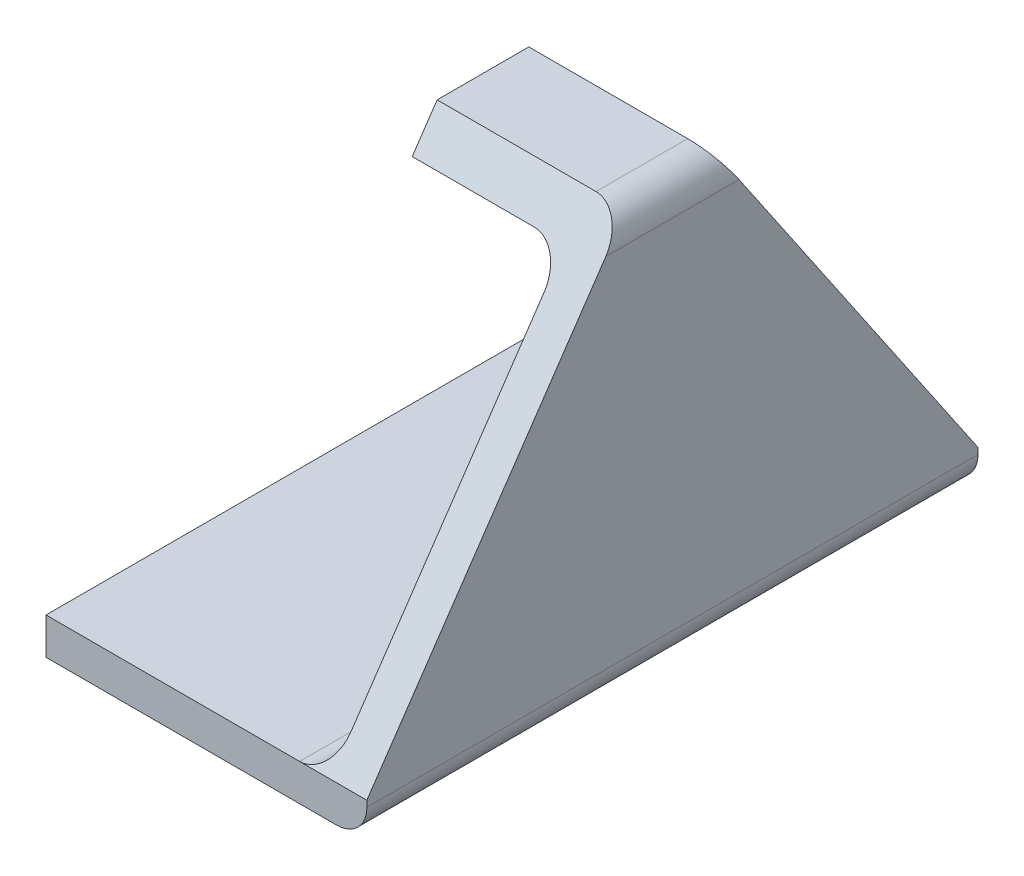
ISO-10303-21;
HEADER;
FILE_DESCRIPTION(('STEP AP214'),'2;1');
FILE_NAME('part.step','',(''),(''),'','','');
FILE_SCHEMA(('AUTOMOTIVE_DESIGN { 1 0 10303 214 1 1 1 1 }'));
ENDSEC;
DATA;
#1=APPLICATION_CONTEXT('core data for automotive mechanical design processes');
#2=APPLICATION_PROTOCOL_DEFINITION('international standard','automotive_design',2000,#1);
#3=PRODUCT_CONTEXT('',#1,'mechanical');
#4=PRODUCT('Part','Part','',(#3));
#5=PRODUCT_RELATED_PRODUCT_CATEGORY('part','',(#4));
#6=PRODUCT_DEFINITION_FORMATION('','',#4);
#7=PRODUCT_DEFINITION_CONTEXT('part definition',#1,'design');
#8=PRODUCT_DEFINITION('design','',#6,#7);
#9=PRODUCT_DEFINITION_SHAPE('','',#8);
#10=(LENGTH_UNIT() NAMED_UNIT(*) SI_UNIT(.MILLI.,.METRE.));
#11=(NAMED_UNIT(*) PLANE_ANGLE_UNIT() SI_UNIT($,.RADIAN.));
#12=(NAMED_UNIT(*) SI_UNIT($,.STERADIAN.) SOLID_ANGLE_UNIT());
#13=UNCERTAINTY_MEASURE_WITH_UNIT(LENGTH_MEASURE(1.E-05),#10,'distance_accuracy_value','');
#14=(GEOMETRIC_REPRESENTATION_CONTEXT(3) GLOBAL_UNCERTAINTY_ASSIGNED_CONTEXT((#13)) GLOBAL_UNIT_ASSIGNED_CONTEXT((#10,
#11,#12)) REPRESENTATION_CONTEXT('',''));
#15=CARTESIAN_POINT('',(0.,0.,0.));
#16=DIRECTION('',(0.,0.,1.));
#17=DIRECTION('',(1.,0.,0.));
#18=AXIS2_PLACEMENT_3D('',#15,#16,#17);
#19=CARTESIAN_POINT('',(0.93,1.37,0.));
#20=DIRECTION('',(1.,0.,0.));
#21=DIRECTION('',(0.,0.,-1.));
#22=AXIS2_PLACEMENT_3D('',#19,#20,#21);
#23=PLANE('',#22);
#24=DIRECTION('',(0.,-0.826926502069528,-0.562310021407279));
#25=VECTOR('',#24,1.);
#26=CARTESIAN_POINT('',(0.93,1.90473741794311,-0.786378555798687));
#27=LINE('',#26,#25);
#28=CARTESIAN_POINT('',(0.93,1.15,-1.2996));
#29=VERTEX_POINT('',#28);
#30=CARTESIAN_POINT('',(0.93,0.22,-1.932));
#31=VERTEX_POINT('',#30);
#32=EDGE_CURVE('E11',#29,#31,#27,.T.);
#33=ORIENTED_EDGE('',*,*,#32,.T.);
#34=DIRECTION('',(0.,0.,1.));
#35=VECTOR('',#34,1.);
#36=CARTESIAN_POINT('',(0.93,0.22,0.));
#37=LINE('',#36,#35);
#38=CARTESIAN_POINT('',(0.93,0.22,-0.0680000000000001));
#39=VERTEX_POINT('',#38);
#40=EDGE_CURVE('E24',#31,#39,#37,.T.);
#41=ORIENTED_EDGE('',*,*,#40,.T.);
#42=DIRECTION('',(0.,0.826926502069528,-0.562310021407279));
#43=VECTOR('',#42,1.);
#44=CARTESIAN_POINT('',(0.93,0.974759299781182,-0.581236323851204));
#45=LINE('',#44,#43);
#46=CARTESIAN_POINT('',(0.93,1.15,-0.7004));
#47=VERTEX_POINT('',#46);
#48=EDGE_CURVE('E242',#39,#47,#45,.T.);
#49=ORIENTED_EDGE('',*,*,#48,.T.);
#50=DIRECTION('',(0.,0.,-1.));
#51=VECTOR('',#50,1.);
#52=CARTESIAN_POINT('',(0.93,1.15,-1.2316));
#53=LINE('',#52,#51);
#54=EDGE_CURVE('E240',#47,#29,#53,.T.);
#55=ORIENTED_EDGE('',*,*,#54,.T.);
#56=EDGE_LOOP('',(#33,#41,#49,#55));
#57=FACE_BOUND('',#56,.T.);
#58=ADVANCED_FACE('F17',(#57),#23,.F.);
#59=CARTESIAN_POINT('',(0.,0.12,-2.));
#60=DIRECTION('',(0.,-1.,0.));
#61=DIRECTION('',(0.,0.,-1.));
#62=AXIS2_PLACEMENT_3D('',#59,#60,#61);
#63=PLANE('',#62);
#64=DIRECTION('',(1.,0.,0.));
#65=VECTOR('',#64,1.);
#66=CARTESIAN_POINT('',(0.,0.12,0.));
#67=LINE('',#66,#65);
#68=CARTESIAN_POINT('',(0.,0.12,0.));
#69=VERTEX_POINT('',#68);
#70=CARTESIAN_POINT('',(0.83,0.12,0.));
#71=VERTEX_POINT('',#70);
#72=EDGE_CURVE('E238',#69,#71,#67,.T.);
#73=ORIENTED_EDGE('',*,*,#72,.T.);
#74=DIRECTION('',(0.,0.,-1.));
#75=VECTOR('',#74,1.);
#76=CARTESIAN_POINT('',(0.83,0.12,-2.));
#77=LINE('',#76,#75);
#78=CARTESIAN_POINT('',(0.83,0.12,-2.));
#79=VERTEX_POINT('',#78);
#80=EDGE_CURVE('E236',#71,#79,#77,.T.);
#81=ORIENTED_EDGE('',*,*,#80,.T.);
#82=DIRECTION('',(-1.,0.,0.));
#83=VECTOR('',#82,1.);
#84=CARTESIAN_POINT('',(0.,0.12,-2.));
#85=LINE('',#84,#83);
#86=CARTESIAN_POINT('',(0.,0.12,-2.));
#87=VERTEX_POINT('',#86);
#88=EDGE_CURVE('E234',#79,#87,#85,.T.);
#89=ORIENTED_EDGE('',*,*,#88,.T.);
#90=DIRECTION('',(0.,0.,1.));
#91=VECTOR('',#90,1.);
#92=CARTESIAN_POINT('',(0.,0.12,0.));
#93=LINE('',#92,#91);
#94=EDGE_CURVE('E231',#87,#69,#93,.T.);
#95=ORIENTED_EDGE('',*,*,#94,.T.);
#96=EDGE_LOOP('',(#73,#81,#89,#95));
#97=FACE_BOUND('',#96,.T.);
#98=ADVANCED_FACE('F284',(#97),#63,.F.);
#99=CARTESIAN_POINT('',(0.,0.12,0.));
#100=DIRECTION('',(1.,0.,0.));
#101=DIRECTION('',(0.,0.,-1.));
#102=AXIS2_PLACEMENT_3D('',#99,#100,#101);
#103=PLANE('',#102);
#104=DIRECTION('',(0.,0.,1.));
#105=VECTOR('',#104,1.);
#106=CARTESIAN_POINT('',(0.,0.,0.));
#107=LINE('',#106,#105);
#108=CARTESIAN_POINT('',(0.,0.,-2.));
#109=VERTEX_POINT('',#108);
#110=CARTESIAN_POINT('',(0.,0.,0.));
#111=VERTEX_POINT('',#110);
#112=EDGE_CURVE('E229',#109,#111,#107,.T.);
#113=ORIENTED_EDGE('',*,*,#112,.T.);
#114=DIRECTION('',(0.,-1.,0.));
#115=VECTOR('',#114,1.);
#116=CARTESIAN_POINT('',(0.,0.12,0.));
#117=LINE('',#116,#115);
#118=EDGE_CURVE('E226',#69,#111,#117,.T.);
#119=ORIENTED_EDGE('',*,*,#118,.F.);
#120=ORIENTED_EDGE('',*,*,#94,.F.);
#121=DIRECTION('',(0.,-1.,0.));
#122=VECTOR('',#121,1.);
#123=CARTESIAN_POINT('',(0.,0.12,-2.));
#124=LINE('',#123,#122);
#125=EDGE_CURVE('E223',#87,#109,#124,.T.);
#126=ORIENTED_EDGE('',*,*,#125,.T.);
#127=EDGE_LOOP('',(#113,#119,#120,#126));
#128=FACE_BOUND('',#127,.T.);
#129=ADVANCED_FACE('F288',(#128),#103,.F.);
#130=CARTESIAN_POINT('',(0.,0.12,0.));
#131=DIRECTION('',(0.,0.,-1.));
#132=DIRECTION('',(-1.,0.,0.));
#133=AXIS2_PLACEMENT_3D('',#130,#131,#132);
#134=PLANE('',#133);
#135=DIRECTION('',(1.,0.,0.));
#136=VECTOR('',#135,1.);
#137=CARTESIAN_POINT('',(0.,0.,0.));
#138=LINE('',#137,#136);
#139=CARTESIAN_POINT('',(0.95,0.,0.));
#140=VERTEX_POINT('',#139);
#141=EDGE_CURVE('E221',#111,#140,#138,.T.);
#142=ORIENTED_EDGE('',*,*,#141,.T.);
#143=CARTESIAN_POINT('',(0.95,0.1,0.));
#144=DIRECTION('',(0.,0.,1.));
#145=DIRECTION('',(-1.,0.,0.));
#146=AXIS2_PLACEMENT_3D('',#143,#144,#145);
#147=CIRCLE('',#146,0.1);
#148=CARTESIAN_POINT('',(1.05,0.1,0.));
#149=VERTEX_POINT('',#148);
#150=EDGE_CURVE('E219',#140,#149,#147,.T.);
#151=ORIENTED_EDGE('',*,*,#150,.T.);
#152=DIRECTION('',(0.,-1.,0.));
#153=VECTOR('',#152,1.);
#154=CARTESIAN_POINT('',(1.05,0.12,0.));
#155=LINE('',#154,#153);
#156=CARTESIAN_POINT('',(1.05,0.12,0.));
#157=VERTEX_POINT('',#156);
#158=EDGE_CURVE('E216',#157,#149,#155,.T.);
#159=ORIENTED_EDGE('',*,*,#158,.F.);
#160=DIRECTION('',(1.,0.,0.));
#161=VECTOR('',#160,1.);
#162=CARTESIAN_POINT('',(-0.2,0.12,0.));
#163=LINE('',#162,#161);
#164=EDGE_CURVE('E213',#71,#157,#163,.T.);
#165=ORIENTED_EDGE('',*,*,#164,.F.);
#166=ORIENTED_EDGE('',*,*,#72,.F.);
#167=ORIENTED_EDGE('',*,*,#118,.T.);
#168=EDGE_LOOP('',(#142,#151,#159,#165,#166,#167));
#169=FACE_BOUND('',#168,.T.);
#170=ADVANCED_FACE('F257',(#169),#134,.F.);
#171=CARTESIAN_POINT('',(1.05,0.12,0.));
#172=DIRECTION('',(-1.,0.,0.));
#173=DIRECTION('',(0.,0.,1.));
#174=AXIS2_PLACEMENT_3D('',#171,#172,#173);
#175=PLANE('',#174);
#176=ORIENTED_EDGE('',*,*,#158,.T.);
#177=DIRECTION('',(0.,0.,-1.));
#178=VECTOR('',#177,1.);
#179=CARTESIAN_POINT('',(1.05,0.1,-2.));
#180=LINE('',#179,#178);
#181=CARTESIAN_POINT('',(1.05,0.1,-2.));
#182=VERTEX_POINT('',#181);
#183=EDGE_CURVE('E211',#149,#182,#180,.T.);
#184=ORIENTED_EDGE('',*,*,#183,.T.);
#185=DIRECTION('',(0.,-1.,0.));
#186=VECTOR('',#185,1.);
#187=CARTESIAN_POINT('',(1.05,0.12,-2.));
#188=LINE('',#187,#186);
#189=CARTESIAN_POINT('',(1.05,0.12,-2.));
#190=VERTEX_POINT('',#189);
#191=EDGE_CURVE('E208',#190,#182,#188,.T.);
#192=ORIENTED_EDGE('',*,*,#191,.F.);
#193=DIRECTION('',(0.,-0.826926502069528,-0.562310021407279));
#194=VECTOR('',#193,1.);
#195=CARTESIAN_POINT('',(1.05,0.12,-2.));
#196=LINE('',#195,#194);
#197=CARTESIAN_POINT('',(1.05,1.27,-1.218));
#198=VERTEX_POINT('',#197);
#199=EDGE_CURVE('E205',#198,#190,#196,.T.);
#200=ORIENTED_EDGE('',*,*,#199,.F.);
#201=DIRECTION('',(0.,0.,1.));
#202=VECTOR('',#201,1.);
#203=CARTESIAN_POINT('',(1.05,1.27,-0.85));
#204=LINE('',#203,#202);
#205=CARTESIAN_POINT('',(1.05,1.27,-0.782));
#206=VERTEX_POINT('',#205);
#207=EDGE_CURVE('E203',#198,#206,#204,.T.);
#208=ORIENTED_EDGE('',*,*,#207,.T.);
#209=DIRECTION('',(0.,0.826926502069528,-0.562310021407279));
#210=VECTOR('',#209,1.);
#211=CARTESIAN_POINT('',(1.05,1.37,-0.85));
#212=LINE('',#211,#210);
#213=EDGE_CURVE('E200',#157,#206,#212,.T.);
#214=ORIENTED_EDGE('',*,*,#213,.F.);
#215=EDGE_LOOP('',(#176,#184,#192,#200,#208,#214));
#216=FACE_BOUND('',#215,.T.);
#217=ADVANCED_FACE('F261',(#216),#175,.F.);
#218=CARTESIAN_POINT('',(0.,0.12,-2.));
#219=DIRECTION('',(0.,0.,1.));
#220=DIRECTION('',(1.,0.,0.));
#221=AXIS2_PLACEMENT_3D('',#218,#219,#220);
#222=PLANE('',#221);
#223=ORIENTED_EDGE('',*,*,#191,.T.);
#224=CARTESIAN_POINT('',(0.95,0.1,-2.));
#225=DIRECTION('',(0.,0.,-1.));
#226=DIRECTION('',(1.,0.,0.));
#227=AXIS2_PLACEMENT_3D('',#224,#225,#226);
#228=CIRCLE('',#227,0.1);
#229=CARTESIAN_POINT('',(0.95,0.,-2.));
#230=VERTEX_POINT('',#229);
#231=EDGE_CURVE('E198',#182,#230,#228,.T.);
#232=ORIENTED_EDGE('',*,*,#231,.T.);
#233=DIRECTION('',(-1.,0.,0.));
#234=VECTOR('',#233,1.);
#235=CARTESIAN_POINT('',(0.,0.,-2.));
#236=LINE('',#235,#234);
#237=EDGE_CURVE('E195',#230,#109,#236,.T.);
#238=ORIENTED_EDGE('',*,*,#237,.T.);
#239=ORIENTED_EDGE('',*,*,#125,.F.);
#240=ORIENTED_EDGE('',*,*,#88,.F.);
#241=DIRECTION('',(1.,0.,0.));
#242=VECTOR('',#241,1.);
#243=CARTESIAN_POINT('',(-0.2,0.12,-2.));
#244=LINE('',#243,#242);
#245=EDGE_CURVE('E192',#79,#190,#244,.T.);
#246=ORIENTED_EDGE('',*,*,#245,.T.);
#247=EDGE_LOOP('',(#223,#232,#238,#239,#240,#246));
#248=FACE_BOUND('',#247,.T.);
#249=ADVANCED_FACE('F299',(#248),#222,.F.);
#250=CARTESIAN_POINT('',(0.,0.,-2.));
#251=DIRECTION('',(0.,-1.,0.));
#252=DIRECTION('',(0.,0.,-1.));
#253=AXIS2_PLACEMENT_3D('',#250,#251,#252);
#254=PLANE('',#253);
#255=ORIENTED_EDGE('',*,*,#237,.F.);
#256=DIRECTION('',(0.,0.,1.));
#257=VECTOR('',#256,1.);
#258=CARTESIAN_POINT('',(0.95,0.,0.));
#259=LINE('',#258,#257);
#260=EDGE_CURVE('E189',#230,#140,#259,.T.);
#261=ORIENTED_EDGE('',*,*,#260,.T.);
#262=ORIENTED_EDGE('',*,*,#141,.F.);
#263=ORIENTED_EDGE('',*,*,#112,.F.);
#264=EDGE_LOOP('',(#255,#261,#262,#263));
#265=FACE_BOUND('',#264,.T.);
#266=ADVANCED_FACE('F302',(#265),#254,.T.);
#267=CARTESIAN_POINT('',(1.05,1.37,-2.));
#268=DIRECTION('',(0.,1.,0.));
#269=DIRECTION('',(0.,0.,1.));
#270=AXIS2_PLACEMENT_3D('',#267,#268,#269);
#271=PLANE('',#270);
#272=DIRECTION('',(-1.,0.,0.));
#273=VECTOR('',#272,1.);
#274=CARTESIAN_POINT('',(1.05,1.37,-0.85));
#275=LINE('',#274,#273);
#276=CARTESIAN_POINT('',(0.95,1.37,-0.85));
#277=VERTEX_POINT('',#276);
#278=CARTESIAN_POINT('',(0.43,1.37,-0.85));
#279=VERTEX_POINT('',#278);
#280=EDGE_CURVE('E187',#277,#279,#275,.T.);
#281=ORIENTED_EDGE('',*,*,#280,.F.);
#282=DIRECTION('',(0.,0.,-1.));
#283=VECTOR('',#282,1.);
#284=CARTESIAN_POINT('',(0.95,1.37,-1.15));
#285=LINE('',#284,#283);
#286=CARTESIAN_POINT('',(0.95,1.37,-1.15));
#287=VERTEX_POINT('',#286);
#288=EDGE_CURVE('E185',#277,#287,#285,.T.);
#289=ORIENTED_EDGE('',*,*,#288,.T.);
#290=DIRECTION('',(1.,0.,0.));
#291=VECTOR('',#290,1.);
#292=CARTESIAN_POINT('',(1.05,1.37,-1.15));
#293=LINE('',#292,#291);
#294=CARTESIAN_POINT('',(0.43,1.37,-1.15));
#295=VERTEX_POINT('',#294);
#296=EDGE_CURVE('E183',#295,#287,#293,.T.);
#297=ORIENTED_EDGE('',*,*,#296,.F.);
#298=DIRECTION('',(0.,0.,-1.));
#299=VECTOR('',#298,1.);
#300=CARTESIAN_POINT('',(0.43,1.37,-1.15));
#301=LINE('',#300,#299);
#302=EDGE_CURVE('E125',#279,#295,#301,.T.);
#303=ORIENTED_EDGE('',*,*,#302,.F.);
#304=EDGE_LOOP('',(#281,#289,#297,#303));
#305=FACE_BOUND('',#304,.T.);
#306=ADVANCED_FACE('F270',(#305),#271,.T.);
#307=CARTESIAN_POINT('',(-0.2,1.37,-0.85));
#308=DIRECTION('',(0.,-0.562310021407279,-0.826926502069528));
#309=DIRECTION('',(0.,0.826926502069528,-0.562310021407279));
#310=AXIS2_PLACEMENT_3D('',#307,#308,#309);
#311=PLANE('',#310);
#312=ORIENTED_EDGE('',*,*,#213,.T.);
#313=CARTESIAN_POINT('',(1.05,1.27,-0.782));
#314=CARTESIAN_POINT('',(1.05,1.32857864376269,-0.821833477758629));
#315=CARTESIAN_POINT('',(1.00857864376269,1.37,-0.85));
#316=CARTESIAN_POINT('',(0.95,1.37,-0.85));
#317=(BOUNDED_CURVE() B_SPLINE_CURVE(3,(#313,#314,#315,#316),.UNSPECIFIED.,.F.,
.F.) B_SPLINE_CURVE_WITH_KNOTS((4,4),(1.5707963267949,3.14159265358979),
.UNSPECIFIED.) CURVE() GEOMETRIC_REPRESENTATION_ITEM() RATIONAL_B_SPLINE_CURVE((1.,
0.804737854124365,0.804737854124365,1.)) REPRESENTATION_ITEM(''));
#318=EDGE_CURVE('E174',#206,#277,#317,.T.);
#319=ORIENTED_EDGE('',*,*,#318,.T.);
#320=ORIENTED_EDGE('',*,*,#280,.T.);
#321=DIRECTION('',(0.,0.826926502069528,-0.56231002140728));
#322=VECTOR('',#321,1.);
#323=CARTESIAN_POINT('',(0.43,1.37,-0.85));
#324=LINE('',#323,#322);
#325=CARTESIAN_POINT('',(0.43,1.25,-0.7684));
#326=VERTEX_POINT('',#325);
#327=EDGE_CURVE('E172',#326,#279,#324,.T.);
#328=ORIENTED_EDGE('',*,*,#327,.F.);
#329=DIRECTION('',(1.,0.,0.));
#330=VECTOR('',#329,1.);
#331=CARTESIAN_POINT('',(0.43,1.25,-0.7684));
#332=LINE('',#331,#330);
#333=CARTESIAN_POINT('',(0.83,1.25,-0.7684));
#334=VERTEX_POINT('',#333);
#335=EDGE_CURVE('E130',#326,#334,#332,.T.);
#336=ORIENTED_EDGE('',*,*,#335,.T.);
#337=CARTESIAN_POINT('',(0.83,1.25,-0.7684));
#338=CARTESIAN_POINT('',(0.88857864376269,1.25,-0.7684));
#339=CARTESIAN_POINT('',(0.93,1.20857864376269,-0.74023347775863));
#340=CARTESIAN_POINT('',(0.93,1.15,-0.7004));
#341=(BOUNDED_CURVE() B_SPLINE_CURVE(3,(#337,#338,#339,#340),.UNSPECIFIED.,.F.,
.F.) B_SPLINE_CURVE_WITH_KNOTS((4,4),(0.,1.5707963267949),
.UNSPECIFIED.) CURVE() GEOMETRIC_REPRESENTATION_ITEM() RATIONAL_B_SPLINE_CURVE((1.,
0.804737854124365,0.804737854124365,1.)) REPRESENTATION_ITEM(''));
#342=EDGE_CURVE('E160',#334,#47,#341,.T.);
#343=ORIENTED_EDGE('',*,*,#342,.T.);
#344=ORIENTED_EDGE('',*,*,#48,.F.);
#345=CARTESIAN_POINT('',(0.93,0.22,-0.0680000000000001));
#346=CARTESIAN_POINT('',(0.93,0.161421356237309,-0.0281665222413706));
#347=CARTESIAN_POINT('',(0.88857864376269,0.12,0.));
#348=CARTESIAN_POINT('',(0.83,0.12,0.));
#349=(BOUNDED_CURVE() B_SPLINE_CURVE(3,(#345,#346,#347,#348),.UNSPECIFIED.,.F.,
.F.) B_SPLINE_CURVE_WITH_KNOTS((4,4),(1.5707963267949,3.14159265358979),
.UNSPECIFIED.) CURVE() GEOMETRIC_REPRESENTATION_ITEM() RATIONAL_B_SPLINE_CURVE((1.,
0.804737854124365,0.804737854124365,1.)) REPRESENTATION_ITEM(''));
#350=EDGE_CURVE('E152',#39,#71,#349,.T.);
#351=ORIENTED_EDGE('',*,*,#350,.T.);
#352=ORIENTED_EDGE('',*,*,#164,.T.);
#353=EDGE_LOOP('',(#312,#319,#320,#328,#336,#343,#344,#351,#352));
#354=FACE_BOUND('',#353,.T.);
#355=ADVANCED_FACE('F249',(#354),#311,.F.);
#356=CARTESIAN_POINT('',(-0.2,0.12,-2.));
#357=DIRECTION('',(0.,-0.562310021407279,0.826926502069528));
#358=DIRECTION('',(0.,-0.826926502069528,-0.562310021407279));
#359=AXIS2_PLACEMENT_3D('',#356,#357,#358);
#360=PLANE('',#359);
#361=ORIENTED_EDGE('',*,*,#296,.T.);
#362=CARTESIAN_POINT('',(0.95,1.37,-1.15));
#363=CARTESIAN_POINT('',(1.00857864376269,1.37,-1.15));
#364=CARTESIAN_POINT('',(1.05,1.32857864376269,-1.17816652224137));
#365=CARTESIAN_POINT('',(1.05,1.27,-1.218));
#366=(BOUNDED_CURVE() B_SPLINE_CURVE(3,(#362,#363,#364,#365),.UNSPECIFIED.,.F.,
.F.) B_SPLINE_CURVE_WITH_KNOTS((4,4),(0.,1.5707963267949),
.UNSPECIFIED.) CURVE() GEOMETRIC_REPRESENTATION_ITEM() RATIONAL_B_SPLINE_CURVE((1.,
0.804737854124365,0.804737854124365,1.)) REPRESENTATION_ITEM(''));
#367=EDGE_CURVE('E144',#287,#198,#366,.T.);
#368=ORIENTED_EDGE('',*,*,#367,.T.);
#369=ORIENTED_EDGE('',*,*,#199,.T.);
#370=ORIENTED_EDGE('',*,*,#245,.F.);
#371=CARTESIAN_POINT('',(0.83,0.12,-2.));
#372=CARTESIAN_POINT('',(0.88857864376269,0.12,-2.));
#373=CARTESIAN_POINT('',(0.93,0.161421356237309,-1.97183347775863));
#374=CARTESIAN_POINT('',(0.93,0.22,-1.932));
#375=(BOUNDED_CURVE() B_SPLINE_CURVE(3,(#371,#372,#373,#374),.UNSPECIFIED.,.F.,
.F.) B_SPLINE_CURVE_WITH_KNOTS((4,4),(0.,1.57079632679489),
.UNSPECIFIED.) CURVE() GEOMETRIC_REPRESENTATION_ITEM() RATIONAL_B_SPLINE_CURVE((1.,
0.804737854124366,0.804737854124366,1.)) REPRESENTATION_ITEM(''));
#376=EDGE_CURVE('E137',#79,#31,#375,.T.);
#377=ORIENTED_EDGE('',*,*,#376,.T.);
#378=ORIENTED_EDGE('',*,*,#32,.F.);
#379=CARTESIAN_POINT('',(0.93,1.15,-1.2996));
#380=CARTESIAN_POINT('',(0.93,1.20857864376269,-1.25976652224137));
#381=CARTESIAN_POINT('',(0.88857864376269,1.25,-1.2316));
#382=CARTESIAN_POINT('',(0.83,1.25,-1.2316));
#383=(BOUNDED_CURVE() B_SPLINE_CURVE(3,(#379,#380,#381,#382),.UNSPECIFIED.,.F.,
.F.) B_SPLINE_CURVE_WITH_KNOTS((4,4),(1.5707963267949,3.14159265358979),
.UNSPECIFIED.) CURVE() GEOMETRIC_REPRESENTATION_ITEM() RATIONAL_B_SPLINE_CURVE((1.,
0.804737854124365,0.804737854124365,1.)) REPRESENTATION_ITEM(''));
#384=CARTESIAN_POINT('',(0.83,1.25,-1.2316));
#385=VERTEX_POINT('',#384);
#386=EDGE_CURVE('E112',#29,#385,#383,.T.);
#387=ORIENTED_EDGE('',*,*,#386,.T.);
#388=DIRECTION('',(1.,0.,0.));
#389=VECTOR('',#388,1.);
#390=CARTESIAN_POINT('',(0.43,1.25,-1.2316));
#391=LINE('',#390,#389);
#392=CARTESIAN_POINT('',(0.43,1.25,-1.2316));
#393=VERTEX_POINT('',#392);
#394=EDGE_CURVE('E106',#393,#385,#391,.T.);
#395=ORIENTED_EDGE('',*,*,#394,.F.);
#396=DIRECTION('',(0.,-0.826926502069528,-0.562310021407279));
#397=VECTOR('',#396,1.);
#398=CARTESIAN_POINT('',(0.43,1.25,-1.2316));
#399=LINE('',#398,#397);
#400=EDGE_CURVE('E110',#295,#393,#399,.T.);
#401=ORIENTED_EDGE('',*,*,#400,.F.);
#402=EDGE_LOOP('',(#361,#368,#369,#370,#377,#378,#387,#395,#401));
#403=FACE_BOUND('',#402,.T.);
#404=ADVANCED_FACE('F109',(#403),#360,.F.);
#405=CARTESIAN_POINT('',(0.43,1.25,-1.2316));
#406=DIRECTION('',(0.,1.,0.));
#407=DIRECTION('',(0.,0.,1.));
#408=AXIS2_PLACEMENT_3D('',#405,#406,#407);
#409=PLANE('',#408);
#410=ORIENTED_EDGE('',*,*,#394,.T.);
#411=DIRECTION('',(0.,0.,1.));
#412=VECTOR('',#411,1.);
#413=CARTESIAN_POINT('',(0.83,1.25,-0.7684));
#414=LINE('',#413,#412);
#415=EDGE_CURVE('E126',#385,#334,#414,.T.);
#416=ORIENTED_EDGE('',*,*,#415,.T.);
#417=ORIENTED_EDGE('',*,*,#335,.F.);
#418=DIRECTION('',(0.,0.,1.));
#419=VECTOR('',#418,1.);
#420=CARTESIAN_POINT('',(0.43,1.25,-1.2316));
#421=LINE('',#420,#419);
#422=EDGE_CURVE('E123',#393,#326,#421,.T.);
#423=ORIENTED_EDGE('',*,*,#422,.F.);
#424=EDGE_LOOP('',(#410,#416,#417,#423));
#425=FACE_BOUND('',#424,.T.);
#426=ADVANCED_FACE('F129',(#425),#409,.F.);
#427=CARTESIAN_POINT('',(0.43,1.59058823529412,-1.));
#428=DIRECTION('',(1.,0.,0.));
#429=DIRECTION('',(0.,0.,-1.));
#430=AXIS2_PLACEMENT_3D('',#427,#428,#429);
#431=PLANE('',#430);
#432=ORIENTED_EDGE('',*,*,#400,.T.);
#433=ORIENTED_EDGE('',*,*,#422,.T.);
#434=ORIENTED_EDGE('',*,*,#327,.T.);
#435=ORIENTED_EDGE('',*,*,#302,.T.);
#436=EDGE_LOOP('',(#432,#433,#434,#435));
#437=FACE_BOUND('',#436,.T.);
#438=ADVANCED_FACE('F121',(#437),#431,.F.);
#439=CARTESIAN_POINT('',(0.95,0.1,0.));
#440=DIRECTION('',(0.,0.,1.));
#441=DIRECTION('',(1.,0.,0.));
#442=AXIS2_PLACEMENT_3D('',#439,#440,#441);
#443=CYLINDRICAL_SURFACE('',#442,0.1);
#444=ORIENTED_EDGE('',*,*,#150,.F.);
#445=ORIENTED_EDGE('',*,*,#260,.F.);
#446=ORIENTED_EDGE('',*,*,#231,.F.);
#447=ORIENTED_EDGE('',*,*,#183,.F.);
#448=EDGE_LOOP('',(#444,#445,#446,#447));
#449=FACE_BOUND('',#448,.T.);
#450=ADVANCED_FACE('F281',(#449),#443,.T.);
#451=CARTESIAN_POINT('',(0.83,0.22,0.));
#452=DIRECTION('',(0.,0.,-1.));
#453=DIRECTION('',(-1.,0.,0.));
#454=AXIS2_PLACEMENT_3D('',#451,#452,#453);
#455=CYLINDRICAL_SURFACE('',#454,0.1);
#456=ORIENTED_EDGE('',*,*,#376,.F.);
#457=ORIENTED_EDGE('',*,*,#80,.F.);
#458=ORIENTED_EDGE('',*,*,#350,.F.);
#459=ORIENTED_EDGE('',*,*,#40,.F.);
#460=EDGE_LOOP('',(#456,#457,#458,#459));
#461=FACE_BOUND('',#460,.T.);
#462=ADVANCED_FACE('F252',(#461),#455,.F.);
#463=CARTESIAN_POINT('',(0.83,1.15,-1.2316));
#464=DIRECTION('',(0.,0.,-1.));
#465=DIRECTION('',(-1.,0.,0.));
#466=AXIS2_PLACEMENT_3D('',#463,#464,#465);
#467=CYLINDRICAL_SURFACE('',#466,0.1);
#468=ORIENTED_EDGE('',*,*,#386,.F.);
#469=ORIENTED_EDGE('',*,*,#54,.F.);
#470=ORIENTED_EDGE('',*,*,#342,.F.);
#471=ORIENTED_EDGE('',*,*,#415,.F.);
#472=EDGE_LOOP('',(#468,#469,#470,#471));
#473=FACE_BOUND('',#472,.T.);
#474=ADVANCED_FACE('F272',(#473),#467,.F.);
#475=CARTESIAN_POINT('',(0.95,1.27,-2.));
#476=DIRECTION('',(0.,0.,1.));
#477=DIRECTION('',(1.,0.,0.));
#478=AXIS2_PLACEMENT_3D('',#475,#476,#477);
#479=CYLINDRICAL_SURFACE('',#478,0.1);
#480=ORIENTED_EDGE('',*,*,#318,.F.);
#481=ORIENTED_EDGE('',*,*,#207,.F.);
#482=ORIENTED_EDGE('',*,*,#367,.F.);
#483=ORIENTED_EDGE('',*,*,#288,.F.);
#484=EDGE_LOOP('',(#480,#481,#482,#483));
#485=FACE_BOUND('',#484,.T.);
#486=ADVANCED_FACE('F266',(#485),#479,.T.);
#487=CLOSED_SHELL('',(#58,#98,#129,#170,#217,#249,#266,#306,#355,#404,#426,#438,#450,#462,#474,#486));
#488=MANIFOLD_SOLID_BREP('B1',#487);
#489=ADVANCED_BREP_SHAPE_REPRESENTATION('',(#18,#488),#14);
#490=SHAPE_DEFINITION_REPRESENTATION(#9,#489);
ENDSEC;
END-ISO-10303-21;
